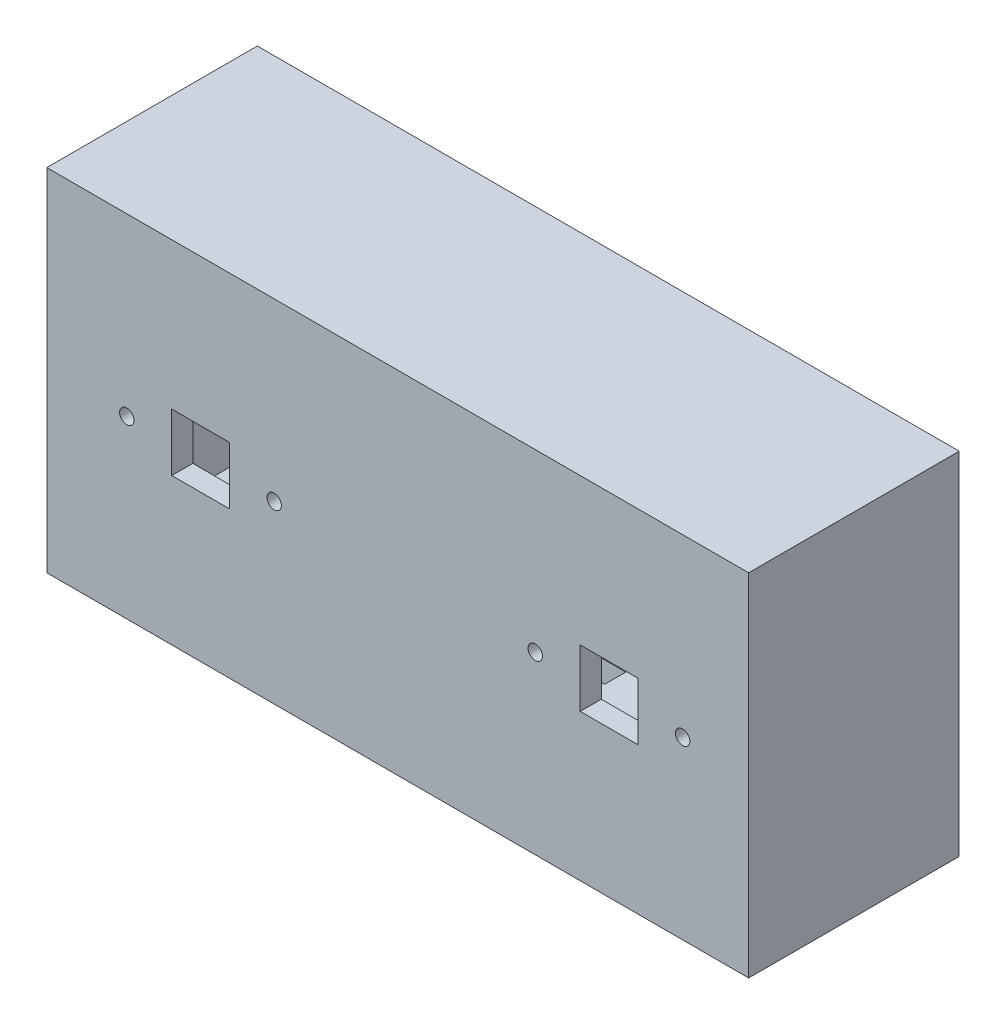
ISO-10303-21;
HEADER;
FILE_DESCRIPTION(('STEP AP214'),'2;1');
FILE_NAME('part.step','',(''),(''),'','','');
FILE_SCHEMA(('AUTOMOTIVE_DESIGN { 1 0 10303 214 1 1 1 1 }'));
ENDSEC;
DATA;
#1=APPLICATION_CONTEXT('core data for automotive mechanical design processes');
#2=APPLICATION_PROTOCOL_DEFINITION('international standard','automotive_design',2000,#1);
#3=PRODUCT_CONTEXT('',#1,'mechanical');
#4=PRODUCT('Part','Part','',(#3));
#5=PRODUCT_RELATED_PRODUCT_CATEGORY('part','',(#4));
#6=PRODUCT_DEFINITION_FORMATION('','',#4);
#7=PRODUCT_DEFINITION_CONTEXT('part definition',#1,'design');
#8=PRODUCT_DEFINITION('design','',#6,#7);
#9=PRODUCT_DEFINITION_SHAPE('','',#8);
#10=(LENGTH_UNIT() NAMED_UNIT(*) SI_UNIT(.MILLI.,.METRE.));
#11=(NAMED_UNIT(*) PLANE_ANGLE_UNIT() SI_UNIT($,.RADIAN.));
#12=(NAMED_UNIT(*) SI_UNIT($,.STERADIAN.) SOLID_ANGLE_UNIT());
#13=UNCERTAINTY_MEASURE_WITH_UNIT(LENGTH_MEASURE(1.E-05),#10,'distance_accuracy_value','');
#14=(GEOMETRIC_REPRESENTATION_CONTEXT(3) GLOBAL_UNCERTAINTY_ASSIGNED_CONTEXT((#13)) GLOBAL_UNIT_ASSIGNED_CONTEXT((#10,
#11,#12)) REPRESENTATION_CONTEXT('',''));
#15=CARTESIAN_POINT('',(0.,0.,0.));
#16=DIRECTION('',(0.,0.,1.));
#17=DIRECTION('',(1.,0.,0.));
#18=AXIS2_PLACEMENT_3D('',#15,#16,#17);
#19=CARTESIAN_POINT('',(0.,50.,-30.));
#20=DIRECTION('',(0.,0.,1.));
#21=DIRECTION('',(1.,0.,0.));
#22=AXIS2_PLACEMENT_3D('',#19,#20,#21);
#23=PLANE('',#22);
#24=DIRECTION('',(-1.,0.,0.));
#25=VECTOR('',#24,1.);
#26=CARTESIAN_POINT('',(0.,0.,-30.));
#27=LINE('',#26,#25);
#28=CARTESIAN_POINT('',(100.,0.,-30.));
#29=VERTEX_POINT('',#28);
#30=CARTESIAN_POINT('',(0.,0.,-30.));
#31=VERTEX_POINT('',#30);
#32=EDGE_CURVE('E379',#29,#31,#27,.T.);
#33=ORIENTED_EDGE('',*,*,#32,.T.);
#34=DIRECTION('',(0.,-1.,0.));
#35=VECTOR('',#34,1.);
#36=CARTESIAN_POINT('',(0.,50.,-30.));
#37=LINE('',#36,#35);
#38=CARTESIAN_POINT('',(0.,50.,-30.));
#39=VERTEX_POINT('',#38);
#40=EDGE_CURVE('E385',#39,#31,#37,.T.);
#41=ORIENTED_EDGE('',*,*,#40,.F.);
#42=DIRECTION('',(-1.,0.,0.));
#43=VECTOR('',#42,1.);
#44=CARTESIAN_POINT('',(0.,50.,-30.));
#45=LINE('',#44,#43);
#46=CARTESIAN_POINT('',(100.,50.,-30.));
#47=VERTEX_POINT('',#46);
#48=EDGE_CURVE('E383',#47,#39,#45,.T.);
#49=ORIENTED_EDGE('',*,*,#48,.F.);
#50=DIRECTION('',(0.,-1.,0.));
#51=VECTOR('',#50,1.);
#52=CARTESIAN_POINT('',(100.,50.,-30.));
#53=LINE('',#52,#51);
#54=EDGE_CURVE('E395',#47,#29,#53,.T.);
#55=ORIENTED_EDGE('',*,*,#54,.T.);
#56=EDGE_LOOP('',(#33,#41,#49,#55));
#57=FACE_BOUND('',#56,.T.);
#58=DIRECTION('',(-1.,0.,0.));
#59=VECTOR('',#58,1.);
#60=CARTESIAN_POINT('',(0.,3.,-30.));
#61=LINE('',#60,#59);
#62=CARTESIAN_POINT('',(97.,3.,-30.));
#63=VERTEX_POINT('',#62);
#64=CARTESIAN_POINT('',(3.,3.,-30.));
#65=VERTEX_POINT('',#64);
#66=EDGE_CURVE('E355',#63,#65,#61,.T.);
#67=ORIENTED_EDGE('',*,*,#66,.F.);
#68=DIRECTION('',(0.,-1.,0.));
#69=VECTOR('',#68,1.);
#70=CARTESIAN_POINT('',(97.,50.,-30.));
#71=LINE('',#70,#69);
#72=CARTESIAN_POINT('',(97.,47.,-30.));
#73=VERTEX_POINT('',#72);
#74=EDGE_CURVE('E360',#73,#63,#71,.T.);
#75=ORIENTED_EDGE('',*,*,#74,.F.);
#76=DIRECTION('',(-1.,0.,0.));
#77=VECTOR('',#76,1.);
#78=CARTESIAN_POINT('',(0.,47.,-30.));
#79=LINE('',#78,#77);
#80=CARTESIAN_POINT('',(3.,47.,-30.));
#81=VERTEX_POINT('',#80);
#82=EDGE_CURVE('E366',#73,#81,#79,.T.);
#83=ORIENTED_EDGE('',*,*,#82,.T.);
#84=DIRECTION('',(0.,-1.,0.));
#85=VECTOR('',#84,1.);
#86=CARTESIAN_POINT('',(3.,50.,-30.));
#87=LINE('',#86,#85);
#88=EDGE_CURVE('E367',#81,#65,#87,.T.);
#89=ORIENTED_EDGE('',*,*,#88,.T.);
#90=EDGE_LOOP('',(#67,#75,#83,#89));
#91=FACE_BOUND('',#90,.T.);
#92=ADVANCED_FACE('F35',(#57,#91),#23,.F.);
#93=CARTESIAN_POINT('',(0.,50.,0.));
#94=DIRECTION('',(1.,0.,0.));
#95=DIRECTION('',(0.,0.,-1.));
#96=AXIS2_PLACEMENT_3D('',#93,#94,#95);
#97=PLANE('',#96);
#98=DIRECTION('',(0.,0.,1.));
#99=VECTOR('',#98,1.);
#100=CARTESIAN_POINT('',(0.,0.,0.));
#101=LINE('',#100,#99);
#102=CARTESIAN_POINT('',(0.,0.,0.));
#103=VERTEX_POINT('',#102);
#104=EDGE_CURVE('E349',#31,#103,#101,.T.);
#105=ORIENTED_EDGE('',*,*,#104,.T.);
#106=DIRECTION('',(0.,-1.,0.));
#107=VECTOR('',#106,1.);
#108=CARTESIAN_POINT('',(0.,50.,0.));
#109=LINE('',#108,#107);
#110=CARTESIAN_POINT('',(0.,50.,0.));
#111=VERTEX_POINT('',#110);
#112=EDGE_CURVE('E11',#111,#103,#109,.T.);
#113=ORIENTED_EDGE('',*,*,#112,.F.);
#114=DIRECTION('',(0.,0.,1.));
#115=VECTOR('',#114,1.);
#116=CARTESIAN_POINT('',(0.,50.,0.));
#117=LINE('',#116,#115);
#118=EDGE_CURVE('E375',#39,#111,#117,.T.);
#119=ORIENTED_EDGE('',*,*,#118,.F.);
#120=ORIENTED_EDGE('',*,*,#40,.T.);
#121=EDGE_LOOP('',(#105,#113,#119,#120));
#122=FACE_BOUND('',#121,.T.);
#123=ADVANCED_FACE('F37',(#122),#97,.F.);
#124=CARTESIAN_POINT('',(0.,50.,0.));
#125=DIRECTION('',(0.,0.,-1.));
#126=DIRECTION('',(-1.,0.,0.));
#127=AXIS2_PLACEMENT_3D('',#124,#125,#126);
#128=PLANE('',#127);
#129=CARTESIAN_POINT('',(90.6,25.,0.));
#130=DIRECTION('',(0.,0.,-1.));
#131=DIRECTION('',(-1.,0.,0.));
#132=AXIS2_PLACEMENT_3D('',#129,#130,#131);
#133=CIRCLE('',#132,1.025);
#134=CARTESIAN_POINT('',(89.575,25.,0.));
#135=VERTEX_POINT('',#134);
#136=EDGE_CURVE('E543',#135,#135,#133,.T.);
#137=ORIENTED_EDGE('',*,*,#136,.T.);
#138=EDGE_LOOP('',(#137));
#139=FACE_BOUND('',#138,.T.);
#140=CARTESIAN_POINT('',(69.6,25.,0.));
#141=DIRECTION('',(0.,0.,-1.));
#142=DIRECTION('',(-1.,0.,0.));
#143=AXIS2_PLACEMENT_3D('',#140,#141,#142);
#144=CIRCLE('',#143,1.025);
#145=CARTESIAN_POINT('',(68.575,25.,0.));
#146=VERTEX_POINT('',#145);
#147=EDGE_CURVE('E553',#146,#146,#144,.T.);
#148=ORIENTED_EDGE('',*,*,#147,.T.);
#149=EDGE_LOOP('',(#148));
#150=FACE_BOUND('',#149,.T.);
#151=CARTESIAN_POINT('',(32.4,25.,0.));
#152=DIRECTION('',(0.,0.,-1.));
#153=DIRECTION('',(-1.,0.,0.));
#154=AXIS2_PLACEMENT_3D('',#151,#152,#153);
#155=CIRCLE('',#154,1.025);
#156=CARTESIAN_POINT('',(31.375,25.,0.));
#157=VERTEX_POINT('',#156);
#158=EDGE_CURVE('E559',#157,#157,#155,.T.);
#159=ORIENTED_EDGE('',*,*,#158,.T.);
#160=EDGE_LOOP('',(#159));
#161=FACE_BOUND('',#160,.T.);
#162=CARTESIAN_POINT('',(11.4,25.,0.));
#163=DIRECTION('',(0.,0.,-1.));
#164=DIRECTION('',(-1.,0.,0.));
#165=AXIS2_PLACEMENT_3D('',#162,#163,#164);
#166=CIRCLE('',#165,1.025);
#167=CARTESIAN_POINT('',(10.375,25.,0.));
#168=VERTEX_POINT('',#167);
#169=EDGE_CURVE('E240',#168,#168,#166,.T.);
#170=ORIENTED_EDGE('',*,*,#169,.T.);
#171=EDGE_LOOP('',(#170));
#172=FACE_BOUND('',#171,.T.);
#173=DIRECTION('',(-1.,0.,0.));
#174=VECTOR('',#173,1.);
#175=CARTESIAN_POINT('',(84.2,29.1,0.));
#176=LINE('',#175,#174);
#177=CARTESIAN_POINT('',(84.2,29.1,0.));
#178=VERTEX_POINT('',#177);
#179=CARTESIAN_POINT('',(76.,29.1,0.));
#180=VERTEX_POINT('',#179);
#181=EDGE_CURVE('E220',#178,#180,#176,.T.);
#182=ORIENTED_EDGE('',*,*,#181,.F.);
#183=DIRECTION('',(0.,1.,0.));
#184=VECTOR('',#183,1.);
#185=CARTESIAN_POINT('',(84.2,29.1,0.));
#186=LINE('',#185,#184);
#187=CARTESIAN_POINT('',(84.2,20.9,0.));
#188=VERTEX_POINT('',#187);
#189=EDGE_CURVE('E50',#188,#178,#186,.T.);
#190=ORIENTED_EDGE('',*,*,#189,.F.);
#191=DIRECTION('',(1.,0.,0.));
#192=VECTOR('',#191,1.);
#193=CARTESIAN_POINT('',(84.2,20.9,0.));
#194=LINE('',#193,#192);
#195=CARTESIAN_POINT('',(76.,20.9,0.));
#196=VERTEX_POINT('',#195);
#197=EDGE_CURVE('E213',#196,#188,#194,.T.);
#198=ORIENTED_EDGE('',*,*,#197,.F.);
#199=DIRECTION('',(0.,-1.,0.));
#200=VECTOR('',#199,1.);
#201=CARTESIAN_POINT('',(76.,29.1,0.));
#202=LINE('',#201,#200);
#203=EDGE_CURVE('E227',#180,#196,#202,.T.);
#204=ORIENTED_EDGE('',*,*,#203,.F.);
#205=EDGE_LOOP('',(#182,#190,#198,#204));
#206=FACE_BOUND('',#205,.T.);
#207=DIRECTION('',(-1.,0.,0.));
#208=VECTOR('',#207,1.);
#209=CARTESIAN_POINT('',(26.,29.1,0.));
#210=LINE('',#209,#208);
#211=CARTESIAN_POINT('',(26.,29.1,0.));
#212=VERTEX_POINT('',#211);
#213=CARTESIAN_POINT('',(17.8,29.1,0.));
#214=VERTEX_POINT('',#213);
#215=EDGE_CURVE('E247',#212,#214,#210,.T.);
#216=ORIENTED_EDGE('',*,*,#215,.F.);
#217=DIRECTION('',(0.,1.,0.));
#218=VECTOR('',#217,1.);
#219=CARTESIAN_POINT('',(26.,29.1,0.));
#220=LINE('',#219,#218);
#221=CARTESIAN_POINT('',(26.,20.9,0.));
#222=VERTEX_POINT('',#221);
#223=EDGE_CURVE('E58',#222,#212,#220,.T.);
#224=ORIENTED_EDGE('',*,*,#223,.F.);
#225=DIRECTION('',(1.,0.,0.));
#226=VECTOR('',#225,1.);
#227=CARTESIAN_POINT('',(26.,20.9,0.));
#228=LINE('',#227,#226);
#229=CARTESIAN_POINT('',(17.8,20.9,0.));
#230=VERTEX_POINT('',#229);
#231=EDGE_CURVE('E253',#230,#222,#228,.T.);
#232=ORIENTED_EDGE('',*,*,#231,.F.);
#233=DIRECTION('',(0.,-1.,0.));
#234=VECTOR('',#233,1.);
#235=CARTESIAN_POINT('',(17.8,29.1,0.));
#236=LINE('',#235,#234);
#237=EDGE_CURVE('E250',#214,#230,#236,.T.);
#238=ORIENTED_EDGE('',*,*,#237,.F.);
#239=EDGE_LOOP('',(#216,#224,#232,#238));
#240=FACE_BOUND('',#239,.T.);
#241=DIRECTION('',(1.,0.,0.));
#242=VECTOR('',#241,1.);
#243=CARTESIAN_POINT('',(0.,0.,0.));
#244=LINE('',#243,#242);
#245=CARTESIAN_POINT('',(100.,0.,0.));
#246=VERTEX_POINT('',#245);
#247=EDGE_CURVE('E388',#103,#246,#244,.T.);
#248=ORIENTED_EDGE('',*,*,#247,.T.);
#249=DIRECTION('',(0.,-1.,0.));
#250=VECTOR('',#249,1.);
#251=CARTESIAN_POINT('',(100.,50.,0.));
#252=LINE('',#251,#250);
#253=CARTESIAN_POINT('',(100.,50.,0.));
#254=VERTEX_POINT('',#253);
#255=EDGE_CURVE('E43',#254,#246,#252,.T.);
#256=ORIENTED_EDGE('',*,*,#255,.F.);
#257=DIRECTION('',(1.,0.,0.));
#258=VECTOR('',#257,1.);
#259=CARTESIAN_POINT('',(0.,50.,0.));
#260=LINE('',#259,#258);
#261=EDGE_CURVE('E378',#111,#254,#260,.T.);
#262=ORIENTED_EDGE('',*,*,#261,.F.);
#263=ORIENTED_EDGE('',*,*,#112,.T.);
#264=EDGE_LOOP('',(#248,#256,#262,#263));
#265=FACE_BOUND('',#264,.T.);
#266=ADVANCED_FACE('F418',(#139,#150,#161,#172,#206,#240,#265),#128,.F.);
#267=CARTESIAN_POINT('',(100.,50.,0.));
#268=DIRECTION('',(-1.,0.,0.));
#269=DIRECTION('',(0.,0.,1.));
#270=AXIS2_PLACEMENT_3D('',#267,#268,#269);
#271=PLANE('',#270);
#272=DIRECTION('',(0.,0.,-1.));
#273=VECTOR('',#272,1.);
#274=CARTESIAN_POINT('',(100.,0.,0.));
#275=LINE('',#274,#273);
#276=EDGE_CURVE('E390',#246,#29,#275,.T.);
#277=ORIENTED_EDGE('',*,*,#276,.T.);
#278=ORIENTED_EDGE('',*,*,#54,.F.);
#279=DIRECTION('',(0.,0.,-1.));
#280=VECTOR('',#279,1.);
#281=CARTESIAN_POINT('',(100.,50.,0.));
#282=LINE('',#281,#280);
#283=EDGE_CURVE('E381',#254,#47,#282,.T.);
#284=ORIENTED_EDGE('',*,*,#283,.F.);
#285=ORIENTED_EDGE('',*,*,#255,.T.);
#286=EDGE_LOOP('',(#277,#278,#284,#285));
#287=FACE_BOUND('',#286,.T.);
#288=ADVANCED_FACE('F402',(#287),#271,.F.);
#289=CARTESIAN_POINT('',(0.,50.,0.));
#290=DIRECTION('',(0.,-1.,0.));
#291=DIRECTION('',(0.,0.,-1.));
#292=AXIS2_PLACEMENT_3D('',#289,#290,#291);
#293=PLANE('',#292);
#294=ORIENTED_EDGE('',*,*,#118,.T.);
#295=ORIENTED_EDGE('',*,*,#261,.T.);
#296=ORIENTED_EDGE('',*,*,#283,.T.);
#297=ORIENTED_EDGE('',*,*,#48,.T.);
#298=EDGE_LOOP('',(#294,#295,#296,#297));
#299=FACE_BOUND('',#298,.T.);
#300=ADVANCED_FACE('F417',(#299),#293,.F.);
#301=CARTESIAN_POINT('',(0.,0.,0.));
#302=DIRECTION('',(0.,-1.,0.));
#303=DIRECTION('',(0.,0.,-1.));
#304=AXIS2_PLACEMENT_3D('',#301,#302,#303);
#305=PLANE('',#304);
#306=DIRECTION('',(0.,0.,1.));
#307=VECTOR('',#306,1.);
#308=CARTESIAN_POINT('',(41.5,0.,-23.));
#309=LINE('',#308,#307);
#310=CARTESIAN_POINT('',(41.5,0.,-26.));
#311=VERTEX_POINT('',#310);
#312=CARTESIAN_POINT('',(41.5,0.,-23.));
#313=VERTEX_POINT('',#312);
#314=EDGE_CURVE('E272',#311,#313,#309,.T.);
#315=ORIENTED_EDGE('',*,*,#314,.T.);
#316=DIRECTION('',(1.,0.,0.));
#317=VECTOR('',#316,1.);
#318=CARTESIAN_POINT('',(41.5,0.,-23.));
#319=LINE('',#318,#317);
#320=CARTESIAN_POINT('',(56.5,0.,-23.));
#321=VERTEX_POINT('',#320);
#322=EDGE_CURVE('E289',#313,#321,#319,.T.);
#323=ORIENTED_EDGE('',*,*,#322,.T.);
#324=DIRECTION('',(0.,0.,-1.));
#325=VECTOR('',#324,1.);
#326=CARTESIAN_POINT('',(56.5,0.,-23.));
#327=LINE('',#326,#325);
#328=CARTESIAN_POINT('',(56.5,0.,-26.));
#329=VERTEX_POINT('',#328);
#330=EDGE_CURVE('E207',#321,#329,#327,.T.);
#331=ORIENTED_EDGE('',*,*,#330,.T.);
#332=DIRECTION('',(-1.,0.,0.));
#333=VECTOR('',#332,1.);
#334=CARTESIAN_POINT('',(41.5,0.,-26.));
#335=LINE('',#334,#333);
#336=EDGE_CURVE('E269',#329,#311,#335,.T.);
#337=ORIENTED_EDGE('',*,*,#336,.T.);
#338=EDGE_LOOP('',(#315,#323,#331,#337));
#339=FACE_BOUND('',#338,.T.);
#340=CARTESIAN_POINT('',(68.055,0.,-12.));
#341=DIRECTION('',(0.,1.,0.));
#342=DIRECTION('',(0.,0.,1.));
#343=AXIS2_PLACEMENT_3D('',#340,#341,#342);
#344=CIRCLE('',#343,1.1);
#345=CARTESIAN_POINT('',(68.055,0.,-10.9));
#346=VERTEX_POINT('',#345);
#347=EDGE_CURVE('E301',#346,#346,#344,.T.);
#348=ORIENTED_EDGE('',*,*,#347,.T.);
#349=EDGE_LOOP('',(#348));
#350=FACE_BOUND('',#349,.T.);
#351=CARTESIAN_POINT('',(40.245,0.,-12.));
#352=DIRECTION('',(0.,1.,0.));
#353=DIRECTION('',(0.,0.,1.));
#354=AXIS2_PLACEMENT_3D('',#351,#352,#353);
#355=CIRCLE('',#354,1.1);
#356=CARTESIAN_POINT('',(40.245,0.,-10.9));
#357=VERTEX_POINT('',#356);
#358=EDGE_CURVE('E307',#357,#357,#355,.T.);
#359=ORIENTED_EDGE('',*,*,#358,.T.);
#360=EDGE_LOOP('',(#359));
#361=FACE_BOUND('',#360,.T.);
#362=DIRECTION('',(0.,0.,-1.));
#363=VECTOR('',#362,1.);
#364=CARTESIAN_POINT('',(65.4,0.,-5.9));
#365=LINE('',#364,#363);
#366=CARTESIAN_POINT('',(65.4,0.,-5.9));
#367=VERTEX_POINT('',#366);
#368=CARTESIAN_POINT('',(65.4,0.,-18.1));
#369=VERTEX_POINT('',#368);
#370=EDGE_CURVE('E316',#367,#369,#365,.T.);
#371=ORIENTED_EDGE('',*,*,#370,.T.);
#372=DIRECTION('',(-1.,0.,0.));
#373=VECTOR('',#372,1.);
#374=CARTESIAN_POINT('',(65.4,0.,-18.1));
#375=LINE('',#374,#373);
#376=CARTESIAN_POINT('',(42.9,0.,-18.1));
#377=VERTEX_POINT('',#376);
#378=EDGE_CURVE('E333',#369,#377,#375,.T.);
#379=ORIENTED_EDGE('',*,*,#378,.T.);
#380=DIRECTION('',(0.,0.,1.));
#381=VECTOR('',#380,1.);
#382=CARTESIAN_POINT('',(42.9,0.,-5.9));
#383=LINE('',#382,#381);
#384=CARTESIAN_POINT('',(42.9,0.,-5.9));
#385=VERTEX_POINT('',#384);
#386=EDGE_CURVE('E310',#377,#385,#383,.T.);
#387=ORIENTED_EDGE('',*,*,#386,.T.);
#388=DIRECTION('',(1.,0.,0.));
#389=VECTOR('',#388,1.);
#390=CARTESIAN_POINT('',(65.4,0.,-5.9));
#391=LINE('',#390,#389);
#392=EDGE_CURVE('E313',#385,#367,#391,.T.);
#393=ORIENTED_EDGE('',*,*,#392,.T.);
#394=EDGE_LOOP('',(#371,#379,#387,#393));
#395=FACE_BOUND('',#394,.T.);
#396=ORIENTED_EDGE('',*,*,#104,.F.);
#397=ORIENTED_EDGE('',*,*,#32,.F.);
#398=ORIENTED_EDGE('',*,*,#276,.F.);
#399=ORIENTED_EDGE('',*,*,#247,.F.);
#400=EDGE_LOOP('',(#396,#397,#398,#399));
#401=FACE_BOUND('',#400,.T.);
#402=ADVANCED_FACE('F408',(#339,#350,#361,#395,#401),#305,.T.);
#403=CARTESIAN_POINT('',(3.,50.,0.));
#404=DIRECTION('',(1.,0.,0.));
#405=DIRECTION('',(0.,0.,-1.));
#406=AXIS2_PLACEMENT_3D('',#403,#404,#405);
#407=PLANE('',#406);
#408=DIRECTION('',(0.,0.,1.));
#409=VECTOR('',#408,1.);
#410=CARTESIAN_POINT('',(3.,3.,0.));
#411=LINE('',#410,#409);
#412=CARTESIAN_POINT('',(3.,3.,-3.));
#413=VERTEX_POINT('',#412);
#414=EDGE_CURVE('E342',#65,#413,#411,.T.);
#415=ORIENTED_EDGE('',*,*,#414,.F.);
#416=ORIENTED_EDGE('',*,*,#88,.F.);
#417=DIRECTION('',(0.,0.,1.));
#418=VECTOR('',#417,1.);
#419=CARTESIAN_POINT('',(3.,47.,0.));
#420=LINE('',#419,#418);
#421=CARTESIAN_POINT('',(3.,47.,-3.));
#422=VERTEX_POINT('',#421);
#423=EDGE_CURVE('E351',#81,#422,#420,.T.);
#424=ORIENTED_EDGE('',*,*,#423,.T.);
#425=DIRECTION('',(0.,-1.,0.));
#426=VECTOR('',#425,1.);
#427=CARTESIAN_POINT('',(3.,50.,-3.));
#428=LINE('',#427,#426);
#429=EDGE_CURVE('E346',#422,#413,#428,.T.);
#430=ORIENTED_EDGE('',*,*,#429,.T.);
#431=EDGE_LOOP('',(#415,#416,#424,#430));
#432=FACE_BOUND('',#431,.T.);
#433=ADVANCED_FACE('F435',(#432),#407,.T.);
#434=CARTESIAN_POINT('',(0.,50.,-3.));
#435=DIRECTION('',(0.,0.,-1.));
#436=DIRECTION('',(-1.,0.,0.));
#437=AXIS2_PLACEMENT_3D('',#434,#435,#436);
#438=PLANE('',#437);
#439=CARTESIAN_POINT('',(90.6,25.,-3.));
#440=DIRECTION('',(0.,0.,-1.));
#441=DIRECTION('',(-1.,0.,0.));
#442=AXIS2_PLACEMENT_3D('',#439,#440,#441);
#443=CIRCLE('',#442,1.025);
#444=CARTESIAN_POINT('',(89.575,25.,-3.));
#445=VERTEX_POINT('',#444);
#446=EDGE_CURVE('E546',#445,#445,#443,.T.);
#447=ORIENTED_EDGE('',*,*,#446,.F.);
#448=EDGE_LOOP('',(#447));
#449=FACE_BOUND('',#448,.T.);
#450=CARTESIAN_POINT('',(69.6,25.,-3.));
#451=DIRECTION('',(0.,0.,-1.));
#452=DIRECTION('',(-1.,0.,0.));
#453=AXIS2_PLACEMENT_3D('',#450,#451,#452);
#454=CIRCLE('',#453,1.025);
#455=CARTESIAN_POINT('',(68.575,25.,-3.));
#456=VERTEX_POINT('',#455);
#457=EDGE_CURVE('E548',#456,#456,#454,.T.);
#458=ORIENTED_EDGE('',*,*,#457,.F.);
#459=EDGE_LOOP('',(#458));
#460=FACE_BOUND('',#459,.T.);
#461=CARTESIAN_POINT('',(32.4,25.,-3.));
#462=DIRECTION('',(0.,0.,-1.));
#463=DIRECTION('',(-1.,0.,0.));
#464=AXIS2_PLACEMENT_3D('',#461,#462,#463);
#465=CIRCLE('',#464,1.025);
#466=CARTESIAN_POINT('',(31.375,25.,-3.));
#467=VERTEX_POINT('',#466);
#468=EDGE_CURVE('E556',#467,#467,#465,.T.);
#469=ORIENTED_EDGE('',*,*,#468,.F.);
#470=EDGE_LOOP('',(#469));
#471=FACE_BOUND('',#470,.T.);
#472=CARTESIAN_POINT('',(11.4,25.,-3.));
#473=DIRECTION('',(0.,0.,-1.));
#474=DIRECTION('',(-1.,0.,0.));
#475=AXIS2_PLACEMENT_3D('',#472,#473,#474);
#476=CIRCLE('',#475,1.025);
#477=CARTESIAN_POINT('',(10.375,25.,-3.));
#478=VERTEX_POINT('',#477);
#479=EDGE_CURVE('E562',#478,#478,#476,.T.);
#480=ORIENTED_EDGE('',*,*,#479,.F.);
#481=EDGE_LOOP('',(#480));
#482=FACE_BOUND('',#481,.T.);
#483=DIRECTION('',(0.,1.,0.));
#484=VECTOR('',#483,1.);
#485=CARTESIAN_POINT('',(84.2,29.1,-3.));
#486=LINE('',#485,#484);
#487=CARTESIAN_POINT('',(84.2,20.9,-3.));
#488=VERTEX_POINT('',#487);
#489=CARTESIAN_POINT('',(84.2,29.1,-3.));
#490=VERTEX_POINT('',#489);
#491=EDGE_CURVE('E211',#488,#490,#486,.T.);
#492=ORIENTED_EDGE('',*,*,#491,.T.);
#493=DIRECTION('',(-1.,0.,0.));
#494=VECTOR('',#493,1.);
#495=CARTESIAN_POINT('',(84.2,29.1,-3.));
#496=LINE('',#495,#494);
#497=CARTESIAN_POINT('',(76.,29.1,-3.));
#498=VERTEX_POINT('',#497);
#499=EDGE_CURVE('E197',#490,#498,#496,.T.);
#500=ORIENTED_EDGE('',*,*,#499,.T.);
#501=DIRECTION('',(0.,-1.,0.));
#502=VECTOR('',#501,1.);
#503=CARTESIAN_POINT('',(76.,29.1,-3.));
#504=LINE('',#503,#502);
#505=CARTESIAN_POINT('',(76.,20.9,-3.));
#506=VERTEX_POINT('',#505);
#507=EDGE_CURVE('E222',#498,#506,#504,.T.);
#508=ORIENTED_EDGE('',*,*,#507,.T.);
#509=DIRECTION('',(1.,0.,0.));
#510=VECTOR('',#509,1.);
#511=CARTESIAN_POINT('',(84.2,20.9,-3.));
#512=LINE('',#511,#510);
#513=EDGE_CURVE('E218',#506,#488,#512,.T.);
#514=ORIENTED_EDGE('',*,*,#513,.T.);
#515=EDGE_LOOP('',(#492,#500,#508,#514));
#516=FACE_BOUND('',#515,.T.);
#517=DIRECTION('',(0.,1.,0.));
#518=VECTOR('',#517,1.);
#519=CARTESIAN_POINT('',(26.,29.1,-3.));
#520=LINE('',#519,#518);
#521=CARTESIAN_POINT('',(26.,20.9,-3.));
#522=VERTEX_POINT('',#521);
#523=CARTESIAN_POINT('',(26.,29.1,-3.));
#524=VERTEX_POINT('',#523);
#525=EDGE_CURVE('E243',#522,#524,#520,.T.);
#526=ORIENTED_EDGE('',*,*,#525,.T.);
#527=DIRECTION('',(-1.,0.,0.));
#528=VECTOR('',#527,1.);
#529=CARTESIAN_POINT('',(26.,29.1,-3.));
#530=LINE('',#529,#528);
#531=CARTESIAN_POINT('',(17.8,29.1,-3.));
#532=VERTEX_POINT('',#531);
#533=EDGE_CURVE('E259',#524,#532,#530,.T.);
#534=ORIENTED_EDGE('',*,*,#533,.T.);
#535=DIRECTION('',(0.,-1.,0.));
#536=VECTOR('',#535,1.);
#537=CARTESIAN_POINT('',(17.8,29.1,-3.));
#538=LINE('',#537,#536);
#539=CARTESIAN_POINT('',(17.8,20.9,-3.));
#540=VERTEX_POINT('',#539);
#541=EDGE_CURVE('E236',#532,#540,#538,.T.);
#542=ORIENTED_EDGE('',*,*,#541,.T.);
#543=DIRECTION('',(1.,0.,0.));
#544=VECTOR('',#543,1.);
#545=CARTESIAN_POINT('',(26.,20.9,-3.));
#546=LINE('',#545,#544);
#547=EDGE_CURVE('E239',#540,#522,#546,.T.);
#548=ORIENTED_EDGE('',*,*,#547,.T.);
#549=EDGE_LOOP('',(#526,#534,#542,#548));
#550=FACE_BOUND('',#549,.T.);
#551=DIRECTION('',(1.,0.,0.));
#552=VECTOR('',#551,1.);
#553=CARTESIAN_POINT('',(0.,3.,-3.));
#554=LINE('',#553,#552);
#555=CARTESIAN_POINT('',(97.,3.,-3.));
#556=VERTEX_POINT('',#555);
#557=EDGE_CURVE('E345',#413,#556,#554,.T.);
#558=ORIENTED_EDGE('',*,*,#557,.F.);
#559=ORIENTED_EDGE('',*,*,#429,.F.);
#560=DIRECTION('',(1.,0.,0.));
#561=VECTOR('',#560,1.);
#562=CARTESIAN_POINT('',(0.,47.,-3.));
#563=LINE('',#562,#561);
#564=CARTESIAN_POINT('',(97.,47.,-3.));
#565=VERTEX_POINT('',#564);
#566=EDGE_CURVE('E354',#422,#565,#563,.T.);
#567=ORIENTED_EDGE('',*,*,#566,.T.);
#568=DIRECTION('',(0.,-1.,0.));
#569=VECTOR('',#568,1.);
#570=CARTESIAN_POINT('',(97.,50.,-3.));
#571=LINE('',#570,#569);
#572=EDGE_CURVE('E350',#565,#556,#571,.T.);
#573=ORIENTED_EDGE('',*,*,#572,.T.);
#574=EDGE_LOOP('',(#558,#559,#567,#573));
#575=FACE_BOUND('',#574,.T.);
#576=ADVANCED_FACE('F216',(#449,#460,#471,#482,#516,#550,#575),#438,.T.);
#577=CARTESIAN_POINT('',(97.,50.,0.));
#578=DIRECTION('',(-1.,0.,0.));
#579=DIRECTION('',(0.,0.,1.));
#580=AXIS2_PLACEMENT_3D('',#577,#578,#579);
#581=PLANE('',#580);
#582=DIRECTION('',(0.,0.,-1.));
#583=VECTOR('',#582,1.);
#584=CARTESIAN_POINT('',(97.,3.,0.));
#585=LINE('',#584,#583);
#586=EDGE_CURVE('E357',#556,#63,#585,.T.);
#587=ORIENTED_EDGE('',*,*,#586,.F.);
#588=ORIENTED_EDGE('',*,*,#572,.F.);
#589=DIRECTION('',(0.,0.,-1.));
#590=VECTOR('',#589,1.);
#591=CARTESIAN_POINT('',(97.,47.,0.));
#592=LINE('',#591,#590);
#593=EDGE_CURVE('E362',#565,#73,#592,.T.);
#594=ORIENTED_EDGE('',*,*,#593,.T.);
#595=ORIENTED_EDGE('',*,*,#74,.T.);
#596=EDGE_LOOP('',(#587,#588,#594,#595));
#597=FACE_BOUND('',#596,.T.);
#598=ADVANCED_FACE('F447',(#597),#581,.T.);
#599=CARTESIAN_POINT('',(0.,47.,0.));
#600=DIRECTION('',(0.,-1.,0.));
#601=DIRECTION('',(0.,0.,-1.));
#602=AXIS2_PLACEMENT_3D('',#599,#600,#601);
#603=PLANE('',#602);
#604=ORIENTED_EDGE('',*,*,#423,.F.);
#605=ORIENTED_EDGE('',*,*,#82,.F.);
#606=ORIENTED_EDGE('',*,*,#593,.F.);
#607=ORIENTED_EDGE('',*,*,#566,.F.);
#608=EDGE_LOOP('',(#604,#605,#606,#607));
#609=FACE_BOUND('',#608,.T.);
#610=ADVANCED_FACE('F443',(#609),#603,.T.);
#611=CARTESIAN_POINT('',(0.,3.,0.));
#612=DIRECTION('',(0.,-1.,0.));
#613=DIRECTION('',(0.,0.,-1.));
#614=AXIS2_PLACEMENT_3D('',#611,#612,#613);
#615=PLANE('',#614);
#616=DIRECTION('',(1.,0.,0.));
#617=VECTOR('',#616,1.);
#618=CARTESIAN_POINT('',(41.5,3.,-23.));
#619=LINE('',#618,#617);
#620=CARTESIAN_POINT('',(41.5,3.,-23.));
#621=VERTEX_POINT('',#620);
#622=CARTESIAN_POINT('',(56.5,3.,-23.));
#623=VERTEX_POINT('',#622);
#624=EDGE_CURVE('E277',#621,#623,#619,.T.);
#625=ORIENTED_EDGE('',*,*,#624,.F.);
#626=DIRECTION('',(0.,0.,1.));
#627=VECTOR('',#626,1.);
#628=CARTESIAN_POINT('',(41.5,3.,-23.));
#629=LINE('',#628,#627);
#630=CARTESIAN_POINT('',(41.5,3.,-26.));
#631=VERTEX_POINT('',#630);
#632=EDGE_CURVE('E275',#631,#621,#629,.T.);
#633=ORIENTED_EDGE('',*,*,#632,.F.);
#634=DIRECTION('',(-1.,0.,0.));
#635=VECTOR('',#634,1.);
#636=CARTESIAN_POINT('',(41.5,3.,-26.));
#637=LINE('',#636,#635);
#638=CARTESIAN_POINT('',(56.5,3.,-26.));
#639=VERTEX_POINT('',#638);
#640=EDGE_CURVE('E283',#639,#631,#637,.T.);
#641=ORIENTED_EDGE('',*,*,#640,.F.);
#642=DIRECTION('',(0.,0.,-1.));
#643=VECTOR('',#642,1.);
#644=CARTESIAN_POINT('',(56.5,3.,-23.));
#645=LINE('',#644,#643);
#646=EDGE_CURVE('E280',#623,#639,#645,.T.);
#647=ORIENTED_EDGE('',*,*,#646,.F.);
#648=EDGE_LOOP('',(#625,#633,#641,#647));
#649=FACE_BOUND('',#648,.T.);
#650=CARTESIAN_POINT('',(68.055,3.,-12.));
#651=DIRECTION('',(0.,1.,0.));
#652=DIRECTION('',(0.,0.,1.));
#653=AXIS2_PLACEMENT_3D('',#650,#651,#652);
#654=CIRCLE('',#653,1.1);
#655=CARTESIAN_POINT('',(68.055,3.,-10.9));
#656=VERTEX_POINT('',#655);
#657=EDGE_CURVE('E298',#656,#656,#654,.T.);
#658=ORIENTED_EDGE('',*,*,#657,.F.);
#659=EDGE_LOOP('',(#658));
#660=FACE_BOUND('',#659,.T.);
#661=CARTESIAN_POINT('',(40.245,3.,-12.));
#662=DIRECTION('',(0.,1.,0.));
#663=DIRECTION('',(0.,0.,1.));
#664=AXIS2_PLACEMENT_3D('',#661,#662,#663);
#665=CIRCLE('',#664,1.1);
#666=CARTESIAN_POINT('',(40.245,3.,-10.9));
#667=VERTEX_POINT('',#666);
#668=EDGE_CURVE('E304',#667,#667,#665,.T.);
#669=ORIENTED_EDGE('',*,*,#668,.F.);
#670=EDGE_LOOP('',(#669));
#671=FACE_BOUND('',#670,.T.);
#672=DIRECTION('',(-1.,0.,0.));
#673=VECTOR('',#672,1.);
#674=CARTESIAN_POINT('',(65.4,3.,-18.1));
#675=LINE('',#674,#673);
#676=CARTESIAN_POINT('',(65.4,3.,-18.1));
#677=VERTEX_POINT('',#676);
#678=CARTESIAN_POINT('',(42.9,3.,-18.1));
#679=VERTEX_POINT('',#678);
#680=EDGE_CURVE('E321',#677,#679,#675,.T.);
#681=ORIENTED_EDGE('',*,*,#680,.F.);
#682=DIRECTION('',(0.,0.,-1.));
#683=VECTOR('',#682,1.);
#684=CARTESIAN_POINT('',(65.4,3.,-5.9));
#685=LINE('',#684,#683);
#686=CARTESIAN_POINT('',(65.4,3.,-5.9));
#687=VERTEX_POINT('',#686);
#688=EDGE_CURVE('E319',#687,#677,#685,.T.);
#689=ORIENTED_EDGE('',*,*,#688,.F.);
#690=DIRECTION('',(1.,0.,0.));
#691=VECTOR('',#690,1.);
#692=CARTESIAN_POINT('',(65.4,3.,-5.9));
#693=LINE('',#692,#691);
#694=CARTESIAN_POINT('',(42.9,3.,-5.9));
#695=VERTEX_POINT('',#694);
#696=EDGE_CURVE('E327',#695,#687,#693,.T.);
#697=ORIENTED_EDGE('',*,*,#696,.F.);
#698=DIRECTION('',(0.,0.,1.));
#699=VECTOR('',#698,1.);
#700=CARTESIAN_POINT('',(42.9,3.,-5.9));
#701=LINE('',#700,#699);
#702=EDGE_CURVE('E324',#679,#695,#701,.T.);
#703=ORIENTED_EDGE('',*,*,#702,.F.);
#704=EDGE_LOOP('',(#681,#689,#697,#703));
#705=FACE_BOUND('',#704,.T.);
#706=ORIENTED_EDGE('',*,*,#414,.T.);
#707=ORIENTED_EDGE('',*,*,#557,.T.);
#708=ORIENTED_EDGE('',*,*,#586,.T.);
#709=ORIENTED_EDGE('',*,*,#66,.T.);
#710=EDGE_LOOP('',(#706,#707,#708,#709));
#711=FACE_BOUND('',#710,.T.);
#712=ADVANCED_FACE('F439',(#649,#660,#671,#705,#711),#615,.F.);
#713=CARTESIAN_POINT('',(65.4,-0.00100000000000013,-5.9));
#714=DIRECTION('',(1.,0.,0.));
#715=DIRECTION('',(0.,0.,-1.));
#716=AXIS2_PLACEMENT_3D('',#713,#714,#715);
#717=PLANE('',#716);
#718=DIRECTION('',(0.,1.,0.));
#719=VECTOR('',#718,1.);
#720=CARTESIAN_POINT('',(65.4,-0.00100000000000013,-5.9));
#721=LINE('',#720,#719);
#722=EDGE_CURVE('E331',#367,#687,#721,.T.);
#723=ORIENTED_EDGE('',*,*,#722,.T.);
#724=ORIENTED_EDGE('',*,*,#688,.T.);
#725=DIRECTION('',(0.,1.,0.));
#726=VECTOR('',#725,1.);
#727=CARTESIAN_POINT('',(65.4,-0.00100000000000013,-18.1));
#728=LINE('',#727,#726);
#729=EDGE_CURVE('E330',#369,#677,#728,.T.);
#730=ORIENTED_EDGE('',*,*,#729,.F.);
#731=ORIENTED_EDGE('',*,*,#370,.F.);
#732=EDGE_LOOP('',(#723,#724,#730,#731));
#733=FACE_BOUND('',#732,.T.);
#734=ADVANCED_FACE('F442',(#733),#717,.F.);
#735=CARTESIAN_POINT('',(65.4,-0.00100000000000013,-5.9));
#736=DIRECTION('',(0.,0.,1.));
#737=DIRECTION('',(1.,0.,0.));
#738=AXIS2_PLACEMENT_3D('',#735,#736,#737);
#739=PLANE('',#738);
#740=DIRECTION('',(0.,1.,0.));
#741=VECTOR('',#740,1.);
#742=CARTESIAN_POINT('',(42.9,-0.00100000000000013,-5.9));
#743=LINE('',#742,#741);
#744=EDGE_CURVE('E334',#385,#695,#743,.T.);
#745=ORIENTED_EDGE('',*,*,#744,.T.);
#746=ORIENTED_EDGE('',*,*,#696,.T.);
#747=ORIENTED_EDGE('',*,*,#722,.F.);
#748=ORIENTED_EDGE('',*,*,#392,.F.);
#749=EDGE_LOOP('',(#745,#746,#747,#748));
#750=FACE_BOUND('',#749,.T.);
#751=ADVANCED_FACE('F460',(#750),#739,.F.);
#752=CARTESIAN_POINT('',(42.9,-0.00100000000000013,-5.9));
#753=DIRECTION('',(-1.,0.,0.));
#754=DIRECTION('',(0.,0.,1.));
#755=AXIS2_PLACEMENT_3D('',#752,#753,#754);
#756=PLANE('',#755);
#757=DIRECTION('',(0.,1.,0.));
#758=VECTOR('',#757,1.);
#759=CARTESIAN_POINT('',(42.9,-0.00100000000000013,-18.1));
#760=LINE('',#759,#758);
#761=EDGE_CURVE('E336',#377,#679,#760,.T.);
#762=ORIENTED_EDGE('',*,*,#761,.T.);
#763=ORIENTED_EDGE('',*,*,#702,.T.);
#764=ORIENTED_EDGE('',*,*,#744,.F.);
#765=ORIENTED_EDGE('',*,*,#386,.F.);
#766=EDGE_LOOP('',(#762,#763,#764,#765));
#767=FACE_BOUND('',#766,.T.);
#768=ADVANCED_FACE('F466',(#767),#756,.F.);
#769=CARTESIAN_POINT('',(65.4,-0.00100000000000013,-18.1));
#770=DIRECTION('',(0.,0.,-1.));
#771=DIRECTION('',(-1.,0.,0.));
#772=AXIS2_PLACEMENT_3D('',#769,#770,#771);
#773=PLANE('',#772);
#774=ORIENTED_EDGE('',*,*,#729,.T.);
#775=ORIENTED_EDGE('',*,*,#680,.T.);
#776=ORIENTED_EDGE('',*,*,#761,.F.);
#777=ORIENTED_EDGE('',*,*,#378,.F.);
#778=EDGE_LOOP('',(#774,#775,#776,#777));
#779=FACE_BOUND('',#778,.T.);
#780=ADVANCED_FACE('F462',(#779),#773,.F.);
#781=CARTESIAN_POINT('',(40.245,3.,-12.));
#782=DIRECTION('',(0.,1.,0.));
#783=DIRECTION('',(0.,0.,1.));
#784=AXIS2_PLACEMENT_3D('',#781,#782,#783);
#785=CYLINDRICAL_SURFACE('',#784,1.1);
#786=ORIENTED_EDGE('',*,*,#358,.F.);
#787=EDGE_LOOP('',(#786));
#788=FACE_BOUND('',#787,.T.);
#789=ORIENTED_EDGE('',*,*,#668,.T.);
#790=EDGE_LOOP('',(#789));
#791=FACE_BOUND('',#790,.T.);
#792=ADVANCED_FACE('F465',(#788,#791),#785,.F.);
#793=CARTESIAN_POINT('',(68.055,3.,-12.));
#794=DIRECTION('',(0.,1.,0.));
#795=DIRECTION('',(0.,0.,1.));
#796=AXIS2_PLACEMENT_3D('',#793,#794,#795);
#797=CYLINDRICAL_SURFACE('',#796,1.1);
#798=ORIENTED_EDGE('',*,*,#347,.F.);
#799=EDGE_LOOP('',(#798));
#800=FACE_BOUND('',#799,.T.);
#801=ORIENTED_EDGE('',*,*,#657,.T.);
#802=EDGE_LOOP('',(#801));
#803=FACE_BOUND('',#802,.T.);
#804=ADVANCED_FACE('F476',(#800,#803),#797,.F.);
#805=CARTESIAN_POINT('',(41.5,-0.00100000000000013,-23.));
#806=DIRECTION('',(-1.,0.,0.));
#807=DIRECTION('',(0.,0.,1.));
#808=AXIS2_PLACEMENT_3D('',#805,#806,#807);
#809=PLANE('',#808);
#810=DIRECTION('',(0.,1.,0.));
#811=VECTOR('',#810,1.);
#812=CARTESIAN_POINT('',(41.5,-0.00100000000000013,-26.));
#813=LINE('',#812,#811);
#814=EDGE_CURVE('E287',#311,#631,#813,.T.);
#815=ORIENTED_EDGE('',*,*,#814,.T.);
#816=ORIENTED_EDGE('',*,*,#632,.T.);
#817=DIRECTION('',(0.,1.,0.));
#818=VECTOR('',#817,1.);
#819=CARTESIAN_POINT('',(41.5,-0.00100000000000013,-23.));
#820=LINE('',#819,#818);
#821=EDGE_CURVE('E286',#313,#621,#820,.T.);
#822=ORIENTED_EDGE('',*,*,#821,.F.);
#823=ORIENTED_EDGE('',*,*,#314,.F.);
#824=EDGE_LOOP('',(#815,#816,#822,#823));
#825=FACE_BOUND('',#824,.T.);
#826=ADVANCED_FACE('F480',(#825),#809,.F.);
#827=CARTESIAN_POINT('',(41.5,-0.00100000000000013,-26.));
#828=DIRECTION('',(0.,0.,-1.));
#829=DIRECTION('',(-1.,0.,0.));
#830=AXIS2_PLACEMENT_3D('',#827,#828,#829);
#831=PLANE('',#830);
#832=DIRECTION('',(0.,1.,0.));
#833=VECTOR('',#832,1.);
#834=CARTESIAN_POINT('',(56.5,-0.00100000000000013,-26.));
#835=LINE('',#834,#833);
#836=EDGE_CURVE('E290',#329,#639,#835,.T.);
#837=ORIENTED_EDGE('',*,*,#836,.T.);
#838=ORIENTED_EDGE('',*,*,#640,.T.);
#839=ORIENTED_EDGE('',*,*,#814,.F.);
#840=ORIENTED_EDGE('',*,*,#336,.F.);
#841=EDGE_LOOP('',(#837,#838,#839,#840));
#842=FACE_BOUND('',#841,.T.);
#843=ADVANCED_FACE('F484',(#842),#831,.F.);
#844=CARTESIAN_POINT('',(56.5,-0.00100000000000013,-23.));
#845=DIRECTION('',(1.,0.,0.));
#846=DIRECTION('',(0.,0.,-1.));
#847=AXIS2_PLACEMENT_3D('',#844,#845,#846);
#848=PLANE('',#847);
#849=DIRECTION('',(0.,1.,0.));
#850=VECTOR('',#849,1.);
#851=CARTESIAN_POINT('',(56.5,-0.00100000000000013,-23.));
#852=LINE('',#851,#850);
#853=EDGE_CURVE('E292',#321,#623,#852,.T.);
#854=ORIENTED_EDGE('',*,*,#853,.T.);
#855=ORIENTED_EDGE('',*,*,#646,.T.);
#856=ORIENTED_EDGE('',*,*,#836,.F.);
#857=ORIENTED_EDGE('',*,*,#330,.F.);
#858=EDGE_LOOP('',(#854,#855,#856,#857));
#859=FACE_BOUND('',#858,.T.);
#860=ADVANCED_FACE('F490',(#859),#848,.F.);
#861=CARTESIAN_POINT('',(41.5,-0.00100000000000013,-23.));
#862=DIRECTION('',(0.,0.,1.));
#863=DIRECTION('',(1.,0.,0.));
#864=AXIS2_PLACEMENT_3D('',#861,#862,#863);
#865=PLANE('',#864);
#866=ORIENTED_EDGE('',*,*,#821,.T.);
#867=ORIENTED_EDGE('',*,*,#624,.T.);
#868=ORIENTED_EDGE('',*,*,#853,.F.);
#869=ORIENTED_EDGE('',*,*,#322,.F.);
#870=EDGE_LOOP('',(#866,#867,#868,#869));
#871=FACE_BOUND('',#870,.T.);
#872=ADVANCED_FACE('F486',(#871),#865,.F.);
#873=CARTESIAN_POINT('',(26.,29.1,-30.001));
#874=DIRECTION('',(1.,0.,0.));
#875=DIRECTION('',(0.,1.,0.));
#876=AXIS2_PLACEMENT_3D('',#873,#874,#875);
#877=PLANE('',#876);
#878=DIRECTION('',(0.,0.,1.));
#879=VECTOR('',#878,1.);
#880=CARTESIAN_POINT('',(26.,20.9,-30.001));
#881=LINE('',#880,#879);
#882=EDGE_CURVE('E257',#522,#222,#881,.T.);
#883=ORIENTED_EDGE('',*,*,#882,.T.);
#884=ORIENTED_EDGE('',*,*,#223,.T.);
#885=DIRECTION('',(0.,0.,1.));
#886=VECTOR('',#885,1.);
#887=CARTESIAN_POINT('',(26.,29.1,-30.001));
#888=LINE('',#887,#886);
#889=EDGE_CURVE('E256',#524,#212,#888,.T.);
#890=ORIENTED_EDGE('',*,*,#889,.F.);
#891=ORIENTED_EDGE('',*,*,#525,.F.);
#892=EDGE_LOOP('',(#883,#884,#890,#891));
#893=FACE_BOUND('',#892,.T.);
#894=ADVANCED_FACE('F489',(#893),#877,.F.);
#895=CARTESIAN_POINT('',(26.,20.9,-30.001));
#896=DIRECTION('',(0.,-1.,0.));
#897=DIRECTION('',(1.,0.,0.));
#898=AXIS2_PLACEMENT_3D('',#895,#896,#897);
#899=PLANE('',#898);
#900=DIRECTION('',(0.,0.,1.));
#901=VECTOR('',#900,1.);
#902=CARTESIAN_POINT('',(17.8,20.9,-30.001));
#903=LINE('',#902,#901);
#904=EDGE_CURVE('E260',#540,#230,#903,.T.);
#905=ORIENTED_EDGE('',*,*,#904,.T.);
#906=ORIENTED_EDGE('',*,*,#231,.T.);
#907=ORIENTED_EDGE('',*,*,#882,.F.);
#908=ORIENTED_EDGE('',*,*,#547,.F.);
#909=EDGE_LOOP('',(#905,#906,#907,#908));
#910=FACE_BOUND('',#909,.T.);
#911=ADVANCED_FACE('F500',(#910),#899,.F.);
#912=CARTESIAN_POINT('',(17.8,29.1,-30.001));
#913=DIRECTION('',(-1.,0.,0.));
#914=DIRECTION('',(0.,0.,1.));
#915=AXIS2_PLACEMENT_3D('',#912,#913,#914);
#916=PLANE('',#915);
#917=DIRECTION('',(0.,0.,1.));
#918=VECTOR('',#917,1.);
#919=CARTESIAN_POINT('',(17.8,29.1,-30.001));
#920=LINE('',#919,#918);
#921=EDGE_CURVE('E262',#532,#214,#920,.T.);
#922=ORIENTED_EDGE('',*,*,#921,.T.);
#923=ORIENTED_EDGE('',*,*,#237,.T.);
#924=ORIENTED_EDGE('',*,*,#904,.F.);
#925=ORIENTED_EDGE('',*,*,#541,.F.);
#926=EDGE_LOOP('',(#922,#923,#924,#925));
#927=FACE_BOUND('',#926,.T.);
#928=ADVANCED_FACE('F504',(#927),#916,.F.);
#929=CARTESIAN_POINT('',(26.,29.1,-30.001));
#930=DIRECTION('',(0.,1.,0.));
#931=DIRECTION('',(-1.,0.,0.));
#932=AXIS2_PLACEMENT_3D('',#929,#930,#931);
#933=PLANE('',#932);
#934=ORIENTED_EDGE('',*,*,#889,.T.);
#935=ORIENTED_EDGE('',*,*,#215,.T.);
#936=ORIENTED_EDGE('',*,*,#921,.F.);
#937=ORIENTED_EDGE('',*,*,#533,.F.);
#938=EDGE_LOOP('',(#934,#935,#936,#937));
#939=FACE_BOUND('',#938,.T.);
#940=ADVANCED_FACE('F501',(#939),#933,.F.);
#941=CARTESIAN_POINT('',(84.2,29.1,-30.001));
#942=DIRECTION('',(1.,0.,0.));
#943=DIRECTION('',(0.,1.,0.));
#944=AXIS2_PLACEMENT_3D('',#941,#942,#943);
#945=PLANE('',#944);
#946=DIRECTION('',(0.,0.,1.));
#947=VECTOR('',#946,1.);
#948=CARTESIAN_POINT('',(84.2,20.9,-30.001));
#949=LINE('',#948,#947);
#950=EDGE_CURVE('E208',#488,#188,#949,.T.);
#951=ORIENTED_EDGE('',*,*,#950,.T.);
#952=ORIENTED_EDGE('',*,*,#189,.T.);
#953=DIRECTION('',(0.,0.,1.));
#954=VECTOR('',#953,1.);
#955=CARTESIAN_POINT('',(84.2,29.1,-30.001));
#956=LINE('',#955,#954);
#957=EDGE_CURVE('E200',#490,#178,#956,.T.);
#958=ORIENTED_EDGE('',*,*,#957,.F.);
#959=ORIENTED_EDGE('',*,*,#491,.F.);
#960=EDGE_LOOP('',(#951,#952,#958,#959));
#961=FACE_BOUND('',#960,.T.);
#962=ADVANCED_FACE('F210',(#961),#945,.F.);
#963=CARTESIAN_POINT('',(84.2,20.9,-30.001));
#964=DIRECTION('',(0.,-1.,0.));
#965=DIRECTION('',(1.,0.,0.));
#966=AXIS2_PLACEMENT_3D('',#963,#964,#965);
#967=PLANE('',#966);
#968=DIRECTION('',(0.,0.,1.));
#969=VECTOR('',#968,1.);
#970=CARTESIAN_POINT('',(76.,20.9,-30.001));
#971=LINE('',#970,#969);
#972=EDGE_CURVE('E233',#506,#196,#971,.T.);
#973=ORIENTED_EDGE('',*,*,#972,.T.);
#974=ORIENTED_EDGE('',*,*,#197,.T.);
#975=ORIENTED_EDGE('',*,*,#950,.F.);
#976=ORIENTED_EDGE('',*,*,#513,.F.);
#977=EDGE_LOOP('',(#973,#974,#975,#976));
#978=FACE_BOUND('',#977,.T.);
#979=ADVANCED_FACE('F514',(#978),#967,.F.);
#980=CARTESIAN_POINT('',(76.,29.1,-30.001));
#981=DIRECTION('',(-1.,0.,0.));
#982=DIRECTION('',(0.,0.,1.));
#983=AXIS2_PLACEMENT_3D('',#980,#981,#982);
#984=PLANE('',#983);
#985=DIRECTION('',(0.,0.,1.));
#986=VECTOR('',#985,1.);
#987=CARTESIAN_POINT('',(76.,29.1,-30.001));
#988=LINE('',#987,#986);
#989=EDGE_CURVE('E202',#498,#180,#988,.T.);
#990=ORIENTED_EDGE('',*,*,#989,.T.);
#991=ORIENTED_EDGE('',*,*,#203,.T.);
#992=ORIENTED_EDGE('',*,*,#972,.F.);
#993=ORIENTED_EDGE('',*,*,#507,.F.);
#994=EDGE_LOOP('',(#990,#991,#992,#993));
#995=FACE_BOUND('',#994,.T.);
#996=ADVANCED_FACE('F518',(#995),#984,.F.);
#997=CARTESIAN_POINT('',(84.2,29.1,-30.001));
#998=DIRECTION('',(0.,1.,0.));
#999=DIRECTION('',(-1.,0.,0.));
#1000=AXIS2_PLACEMENT_3D('',#997,#998,#999);
#1001=PLANE('',#1000);
#1002=ORIENTED_EDGE('',*,*,#957,.T.);
#1003=ORIENTED_EDGE('',*,*,#181,.T.);
#1004=ORIENTED_EDGE('',*,*,#989,.F.);
#1005=ORIENTED_EDGE('',*,*,#499,.F.);
#1006=EDGE_LOOP('',(#1002,#1003,#1004,#1005));
#1007=FACE_BOUND('',#1006,.T.);
#1008=ADVANCED_FACE('F198',(#1007),#1001,.F.);
#1009=CARTESIAN_POINT('',(11.4,25.,-3.));
#1010=DIRECTION('',(0.,0.,-1.));
#1011=DIRECTION('',(-1.,0.,0.));
#1012=AXIS2_PLACEMENT_3D('',#1009,#1010,#1011);
#1013=CYLINDRICAL_SURFACE('',#1012,1.025);
#1014=ORIENTED_EDGE('',*,*,#169,.F.);
#1015=EDGE_LOOP('',(#1014));
#1016=FACE_BOUND('',#1015,.T.);
#1017=ORIENTED_EDGE('',*,*,#479,.T.);
#1018=EDGE_LOOP('',(#1017));
#1019=FACE_BOUND('',#1018,.T.);
#1020=ADVANCED_FACE('F517',(#1016,#1019),#1013,.F.);
#1021=CARTESIAN_POINT('',(32.4,25.,-3.));
#1022=DIRECTION('',(0.,0.,-1.));
#1023=DIRECTION('',(-1.,0.,0.));
#1024=AXIS2_PLACEMENT_3D('',#1021,#1022,#1023);
#1025=CYLINDRICAL_SURFACE('',#1024,1.025);
#1026=ORIENTED_EDGE('',*,*,#158,.F.);
#1027=EDGE_LOOP('',(#1026));
#1028=FACE_BOUND('',#1027,.T.);
#1029=ORIENTED_EDGE('',*,*,#468,.T.);
#1030=EDGE_LOOP('',(#1029));
#1031=FACE_BOUND('',#1030,.T.);
#1032=ADVANCED_FACE('F527',(#1028,#1031),#1025,.F.);
#1033=CARTESIAN_POINT('',(69.6,25.,-3.));
#1034=DIRECTION('',(0.,0.,-1.));
#1035=DIRECTION('',(-1.,0.,0.));
#1036=AXIS2_PLACEMENT_3D('',#1033,#1034,#1035);
#1037=CYLINDRICAL_SURFACE('',#1036,1.025);
#1038=ORIENTED_EDGE('',*,*,#147,.F.);
#1039=EDGE_LOOP('',(#1038));
#1040=FACE_BOUND('',#1039,.T.);
#1041=ORIENTED_EDGE('',*,*,#457,.T.);
#1042=EDGE_LOOP('',(#1041));
#1043=FACE_BOUND('',#1042,.T.);
#1044=ADVANCED_FACE('F531',(#1040,#1043),#1037,.F.);
#1045=CARTESIAN_POINT('',(90.6,25.,-3.));
#1046=DIRECTION('',(0.,0.,-1.));
#1047=DIRECTION('',(-1.,0.,0.));
#1048=AXIS2_PLACEMENT_3D('',#1045,#1046,#1047);
#1049=CYLINDRICAL_SURFACE('',#1048,1.025);
#1050=ORIENTED_EDGE('',*,*,#136,.F.);
#1051=EDGE_LOOP('',(#1050));
#1052=FACE_BOUND('',#1051,.T.);
#1053=ORIENTED_EDGE('',*,*,#446,.T.);
#1054=EDGE_LOOP('',(#1053));
#1055=FACE_BOUND('',#1054,.T.);
#1056=ADVANCED_FACE('F535',(#1052,#1055),#1049,.F.);
#1057=CLOSED_SHELL('',(#92,#123,#266,#288,#300,#402,#433,#576,#598,#610,#712,#734,#751,#768,
#780,#792,#804,#826,#843,#860,#872,#894,#911,#928,#940,#962,#979,#996,#1008,#1020,#1032,#1044,#1056));
#1058=MANIFOLD_SOLID_BREP('B2',#1057);
#1059=ADVANCED_BREP_SHAPE_REPRESENTATION('',(#18,#1058),#14);
#1060=SHAPE_DEFINITION_REPRESENTATION(#9,#1059);
ENDSEC;
END-ISO-10303-21;
